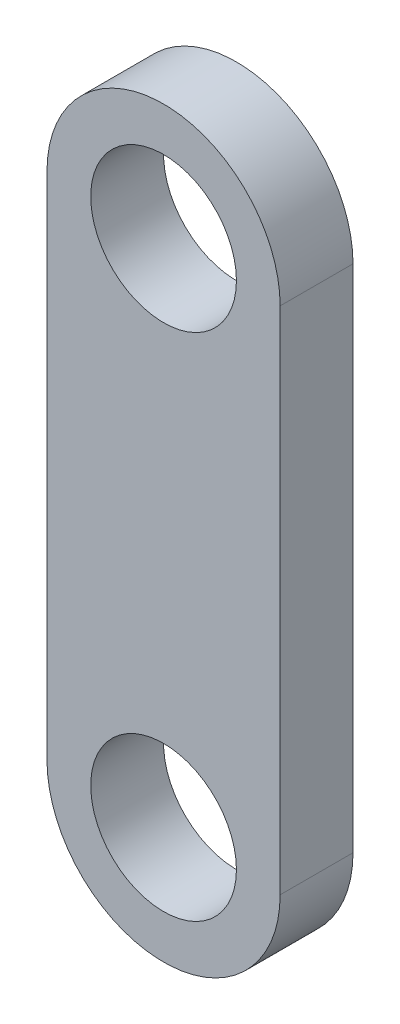
ISO-10303-21;
HEADER;
FILE_DESCRIPTION(('STEP AP214'),'2;1');
FILE_NAME('part.step','',(''),(''),'','','');
FILE_SCHEMA(('AUTOMOTIVE_DESIGN { 1 0 10303 214 1 1 1 1 }'));
ENDSEC;
DATA;
#1=APPLICATION_CONTEXT('core data for automotive mechanical design processes');
#2=APPLICATION_PROTOCOL_DEFINITION('international standard','automotive_design',2000,#1);
#3=PRODUCT_CONTEXT('',#1,'mechanical');
#4=PRODUCT('Part','Part','',(#3));
#5=PRODUCT_RELATED_PRODUCT_CATEGORY('part','',(#4));
#6=PRODUCT_DEFINITION_FORMATION('','',#4);
#7=PRODUCT_DEFINITION_CONTEXT('part definition',#1,'design');
#8=PRODUCT_DEFINITION('design','',#6,#7);
#9=PRODUCT_DEFINITION_SHAPE('','',#8);
#10=(LENGTH_UNIT() NAMED_UNIT(*) SI_UNIT(.MILLI.,.METRE.));
#11=(NAMED_UNIT(*) PLANE_ANGLE_UNIT() SI_UNIT($,.RADIAN.));
#12=(NAMED_UNIT(*) SI_UNIT($,.STERADIAN.) SOLID_ANGLE_UNIT());
#13=UNCERTAINTY_MEASURE_WITH_UNIT(LENGTH_MEASURE(1.E-05),#10,'distance_accuracy_value','');
#14=(GEOMETRIC_REPRESENTATION_CONTEXT(3) GLOBAL_UNCERTAINTY_ASSIGNED_CONTEXT((#13)) GLOBAL_UNIT_ASSIGNED_CONTEXT((#10,
#11,#12)) REPRESENTATION_CONTEXT('',''));
#15=CARTESIAN_POINT('',(0.,0.,0.));
#16=DIRECTION('',(0.,0.,1.));
#17=DIRECTION('',(1.,0.,0.));
#18=AXIS2_PLACEMENT_3D('',#15,#16,#17);
#19=CARTESIAN_POINT('',(0.,-1.75,0.5));
#20=DIRECTION('',(0.,0.,1.));
#21=DIRECTION('',(1.,0.,0.));
#22=AXIS2_PLACEMENT_3D('',#19,#20,#21);
#23=PLANE('',#22);
#24=CARTESIAN_POINT('',(0.,1.75,0.5));
#25=DIRECTION('',(0.,0.,1.));
#26=DIRECTION('',(1.,0.,0.));
#27=AXIS2_PLACEMENT_3D('',#24,#25,#26);
#28=CIRCLE('',#27,0.5);
#29=CARTESIAN_POINT('',(0.499999999999999,1.75,0.5));
#30=VERTEX_POINT('',#29);
#31=EDGE_CURVE('E100',#30,#30,#28,.T.);
#32=ORIENTED_EDGE('',*,*,#31,.F.);
#33=EDGE_LOOP('',(#32));
#34=FACE_BOUND('',#33,.T.);
#35=CARTESIAN_POINT('',(0.,-1.75,0.5));
#36=DIRECTION('',(0.,0.,1.));
#37=DIRECTION('',(1.,0.,0.));
#38=AXIS2_PLACEMENT_3D('',#35,#36,#37);
#39=CIRCLE('',#38,0.800000000000001);
#40=CARTESIAN_POINT('',(-0.800000000000001,-1.75,0.5));
#41=VERTEX_POINT('',#40);
#42=CARTESIAN_POINT('',(0.800000000000001,-1.75,0.5));
#43=VERTEX_POINT('',#42);
#44=EDGE_CURVE('E85',#41,#43,#39,.T.);
#45=ORIENTED_EDGE('',*,*,#44,.T.);
#46=DIRECTION('',(0.,1.,0.));
#47=VECTOR('',#46,1.);
#48=CARTESIAN_POINT('',(0.800000000000001,-1.75,0.5));
#49=LINE('',#48,#47);
#50=CARTESIAN_POINT('',(0.8,1.75,0.5));
#51=VERTEX_POINT('',#50);
#52=EDGE_CURVE('E80',#43,#51,#49,.T.);
#53=ORIENTED_EDGE('',*,*,#52,.T.);
#54=CARTESIAN_POINT('',(0.,1.75,0.5));
#55=DIRECTION('',(0.,0.,1.));
#56=DIRECTION('',(1.,0.,0.));
#57=AXIS2_PLACEMENT_3D('',#54,#55,#56);
#58=CIRCLE('',#57,0.800000000000001);
#59=CARTESIAN_POINT('',(-0.800000000000001,1.75,0.5));
#60=VERTEX_POINT('',#59);
#61=EDGE_CURVE('E83',#51,#60,#58,.T.);
#62=ORIENTED_EDGE('',*,*,#61,.T.);
#63=DIRECTION('',(0.,-1.,0.));
#64=VECTOR('',#63,1.);
#65=CARTESIAN_POINT('',(-0.800000000000001,-1.75,0.5));
#66=LINE('',#65,#64);
#67=EDGE_CURVE('E50',#60,#41,#66,.T.);
#68=ORIENTED_EDGE('',*,*,#67,.T.);
#69=EDGE_LOOP('',(#45,#53,#62,#68));
#70=FACE_BOUND('',#69,.T.);
#71=CARTESIAN_POINT('',(0.,-1.75,0.5));
#72=DIRECTION('',(0.,0.,1.));
#73=DIRECTION('',(1.,0.,0.));
#74=AXIS2_PLACEMENT_3D('',#71,#72,#73);
#75=CIRCLE('',#74,0.5);
#76=CARTESIAN_POINT('',(0.5,-1.75,0.5));
#77=VERTEX_POINT('',#76);
#78=EDGE_CURVE('E115',#77,#77,#75,.T.);
#79=ORIENTED_EDGE('',*,*,#78,.F.);
#80=EDGE_LOOP('',(#79));
#81=FACE_BOUND('',#80,.T.);
#82=ADVANCED_FACE('F33',(#34,#70,#81),#23,.T.);
#83=CARTESIAN_POINT('',(0.,-1.75,0.));
#84=DIRECTION('',(0.,0.,1.));
#85=DIRECTION('',(1.,0.,0.));
#86=AXIS2_PLACEMENT_3D('',#83,#84,#85);
#87=PLANE('',#86);
#88=CARTESIAN_POINT('',(0.,-1.75,0.));
#89=DIRECTION('',(0.,0.,1.));
#90=DIRECTION('',(1.,0.,0.));
#91=AXIS2_PLACEMENT_3D('',#88,#89,#90);
#92=CIRCLE('',#91,0.800000000000001);
#93=CARTESIAN_POINT('',(-0.800000000000001,-1.75,0.));
#94=VERTEX_POINT('',#93);
#95=CARTESIAN_POINT('',(0.800000000000001,-1.75,0.));
#96=VERTEX_POINT('',#95);
#97=EDGE_CURVE('E97',#94,#96,#92,.T.);
#98=ORIENTED_EDGE('',*,*,#97,.F.);
#99=DIRECTION('',(0.,-1.,0.));
#100=VECTOR('',#99,1.);
#101=CARTESIAN_POINT('',(-0.800000000000001,-1.75,0.));
#102=LINE('',#101,#100);
#103=CARTESIAN_POINT('',(-0.800000000000001,1.75,0.));
#104=VERTEX_POINT('',#103);
#105=EDGE_CURVE('E73',#104,#94,#102,.T.);
#106=ORIENTED_EDGE('',*,*,#105,.F.);
#107=CARTESIAN_POINT('',(0.,1.75,0.));
#108=DIRECTION('',(0.,0.,1.));
#109=DIRECTION('',(1.,0.,0.));
#110=AXIS2_PLACEMENT_3D('',#107,#108,#109);
#111=CIRCLE('',#110,0.800000000000001);
#112=CARTESIAN_POINT('',(0.8,1.75,0.));
#113=VERTEX_POINT('',#112);
#114=EDGE_CURVE('E67',#113,#104,#111,.T.);
#115=ORIENTED_EDGE('',*,*,#114,.F.);
#116=DIRECTION('',(0.,1.,0.));
#117=VECTOR('',#116,1.);
#118=CARTESIAN_POINT('',(0.800000000000001,-1.75,0.));
#119=LINE('',#118,#117);
#120=EDGE_CURVE('E89',#96,#113,#119,.T.);
#121=ORIENTED_EDGE('',*,*,#120,.F.);
#122=EDGE_LOOP('',(#98,#106,#115,#121));
#123=FACE_BOUND('',#122,.T.);
#124=CARTESIAN_POINT('',(0.,1.75,0.));
#125=DIRECTION('',(0.,0.,1.));
#126=DIRECTION('',(1.,0.,0.));
#127=AXIS2_PLACEMENT_3D('',#124,#125,#126);
#128=CIRCLE('',#127,0.5);
#129=CARTESIAN_POINT('',(0.499999999999999,1.75,0.));
#130=VERTEX_POINT('',#129);
#131=EDGE_CURVE('E112',#130,#130,#128,.T.);
#132=ORIENTED_EDGE('',*,*,#131,.T.);
#133=EDGE_LOOP('',(#132));
#134=FACE_BOUND('',#133,.T.);
#135=CARTESIAN_POINT('',(0.,-1.75,0.));
#136=DIRECTION('',(0.,0.,1.));
#137=DIRECTION('',(1.,0.,0.));
#138=AXIS2_PLACEMENT_3D('',#135,#136,#137);
#139=CIRCLE('',#138,0.5);
#140=CARTESIAN_POINT('',(0.5,-1.75,0.));
#141=VERTEX_POINT('',#140);
#142=EDGE_CURVE('E118',#141,#141,#139,.T.);
#143=ORIENTED_EDGE('',*,*,#142,.T.);
#144=EDGE_LOOP('',(#143));
#145=FACE_BOUND('',#144,.T.);
#146=ADVANCED_FACE('F108',(#123,#134,#145),#87,.F.);
#147=CARTESIAN_POINT('',(0.,-1.75,0.5));
#148=DIRECTION('',(0.,0.,-1.));
#149=DIRECTION('',(-1.,0.,0.));
#150=AXIS2_PLACEMENT_3D('',#147,#148,#149);
#151=CYLINDRICAL_SURFACE('',#150,0.800000000000001);
#152=ORIENTED_EDGE('',*,*,#97,.T.);
#153=DIRECTION('',(0.,0.,-1.));
#154=VECTOR('',#153,1.);
#155=CARTESIAN_POINT('',(0.800000000000001,-1.75,0.5));
#156=LINE('',#155,#154);
#157=EDGE_CURVE('E11',#43,#96,#156,.T.);
#158=ORIENTED_EDGE('',*,*,#157,.F.);
#159=ORIENTED_EDGE('',*,*,#44,.F.);
#160=DIRECTION('',(0.,0.,-1.));
#161=VECTOR('',#160,1.);
#162=CARTESIAN_POINT('',(-0.800000000000001,-1.75,0.5));
#163=LINE('',#162,#161);
#164=EDGE_CURVE('E93',#41,#94,#163,.T.);
#165=ORIENTED_EDGE('',*,*,#164,.T.);
#166=EDGE_LOOP('',(#152,#158,#159,#165));
#167=FACE_BOUND('',#166,.T.);
#168=ADVANCED_FACE('F35',(#167),#151,.T.);
#169=CARTESIAN_POINT('',(0.800000000000001,-1.75,0.5));
#170=DIRECTION('',(-1.,0.,0.));
#171=DIRECTION('',(0.,-1.,0.));
#172=AXIS2_PLACEMENT_3D('',#169,#170,#171);
#173=PLANE('',#172);
#174=ORIENTED_EDGE('',*,*,#120,.T.);
#175=DIRECTION('',(0.,0.,-1.));
#176=VECTOR('',#175,1.);
#177=CARTESIAN_POINT('',(0.8,1.75,0.5));
#178=LINE('',#177,#176);
#179=EDGE_CURVE('E42',#51,#113,#178,.T.);
#180=ORIENTED_EDGE('',*,*,#179,.F.);
#181=ORIENTED_EDGE('',*,*,#52,.F.);
#182=ORIENTED_EDGE('',*,*,#157,.T.);
#183=EDGE_LOOP('',(#174,#180,#181,#182));
#184=FACE_BOUND('',#183,.T.);
#185=ADVANCED_FACE('F88',(#184),#173,.F.);
#186=CARTESIAN_POINT('',(0.,1.75,0.5));
#187=DIRECTION('',(0.,0.,-1.));
#188=DIRECTION('',(-1.,0.,0.));
#189=AXIS2_PLACEMENT_3D('',#186,#187,#188);
#190=CYLINDRICAL_SURFACE('',#189,0.800000000000001);
#191=ORIENTED_EDGE('',*,*,#114,.T.);
#192=DIRECTION('',(0.,0.,-1.));
#193=VECTOR('',#192,1.);
#194=CARTESIAN_POINT('',(-0.800000000000001,1.75,0.5));
#195=LINE('',#194,#193);
#196=EDGE_CURVE('E90',#60,#104,#195,.T.);
#197=ORIENTED_EDGE('',*,*,#196,.F.);
#198=ORIENTED_EDGE('',*,*,#61,.F.);
#199=ORIENTED_EDGE('',*,*,#179,.T.);
#200=EDGE_LOOP('',(#191,#197,#198,#199));
#201=FACE_BOUND('',#200,.T.);
#202=ADVANCED_FACE('F91',(#201),#190,.T.);
#203=CARTESIAN_POINT('',(-0.800000000000001,-1.75,0.5));
#204=DIRECTION('',(1.,0.,0.));
#205=DIRECTION('',(0.,1.,0.));
#206=AXIS2_PLACEMENT_3D('',#203,#204,#205);
#207=PLANE('',#206);
#208=ORIENTED_EDGE('',*,*,#105,.T.);
#209=ORIENTED_EDGE('',*,*,#164,.F.);
#210=ORIENTED_EDGE('',*,*,#67,.F.);
#211=ORIENTED_EDGE('',*,*,#196,.T.);
#212=EDGE_LOOP('',(#208,#209,#210,#211));
#213=FACE_BOUND('',#212,.T.);
#214=ADVANCED_FACE('F105',(#213),#207,.F.);
#215=CARTESIAN_POINT('',(0.,1.75,0.5));
#216=DIRECTION('',(0.,0.,-1.));
#217=DIRECTION('',(-1.,0.,0.));
#218=AXIS2_PLACEMENT_3D('',#215,#216,#217);
#219=CYLINDRICAL_SURFACE('',#218,0.5);
#220=ORIENTED_EDGE('',*,*,#31,.T.);
#221=EDGE_LOOP('',(#220));
#222=FACE_BOUND('',#221,.T.);
#223=ORIENTED_EDGE('',*,*,#131,.F.);
#224=EDGE_LOOP('',(#223));
#225=FACE_BOUND('',#224,.T.);
#226=ADVANCED_FACE('F135',(#222,#225),#219,.F.);
#227=CARTESIAN_POINT('',(0.,-1.75,0.5));
#228=DIRECTION('',(0.,0.,-1.));
#229=DIRECTION('',(-1.,0.,0.));
#230=AXIS2_PLACEMENT_3D('',#227,#228,#229);
#231=CYLINDRICAL_SURFACE('',#230,0.5);
#232=ORIENTED_EDGE('',*,*,#78,.T.);
#233=EDGE_LOOP('',(#232));
#234=FACE_BOUND('',#233,.T.);
#235=ORIENTED_EDGE('',*,*,#142,.F.);
#236=EDGE_LOOP('',(#235));
#237=FACE_BOUND('',#236,.T.);
#238=ADVANCED_FACE('F124',(#234,#237),#231,.F.);
#239=CLOSED_SHELL('',(#82,#146,#168,#185,#202,#214,#226,#238));
#240=MANIFOLD_SOLID_BREP('B2',#239);
#241=ADVANCED_BREP_SHAPE_REPRESENTATION('',(#18,#240),#14);
#242=SHAPE_DEFINITION_REPRESENTATION(#9,#241);
ENDSEC;
END-ISO-10303-21;
